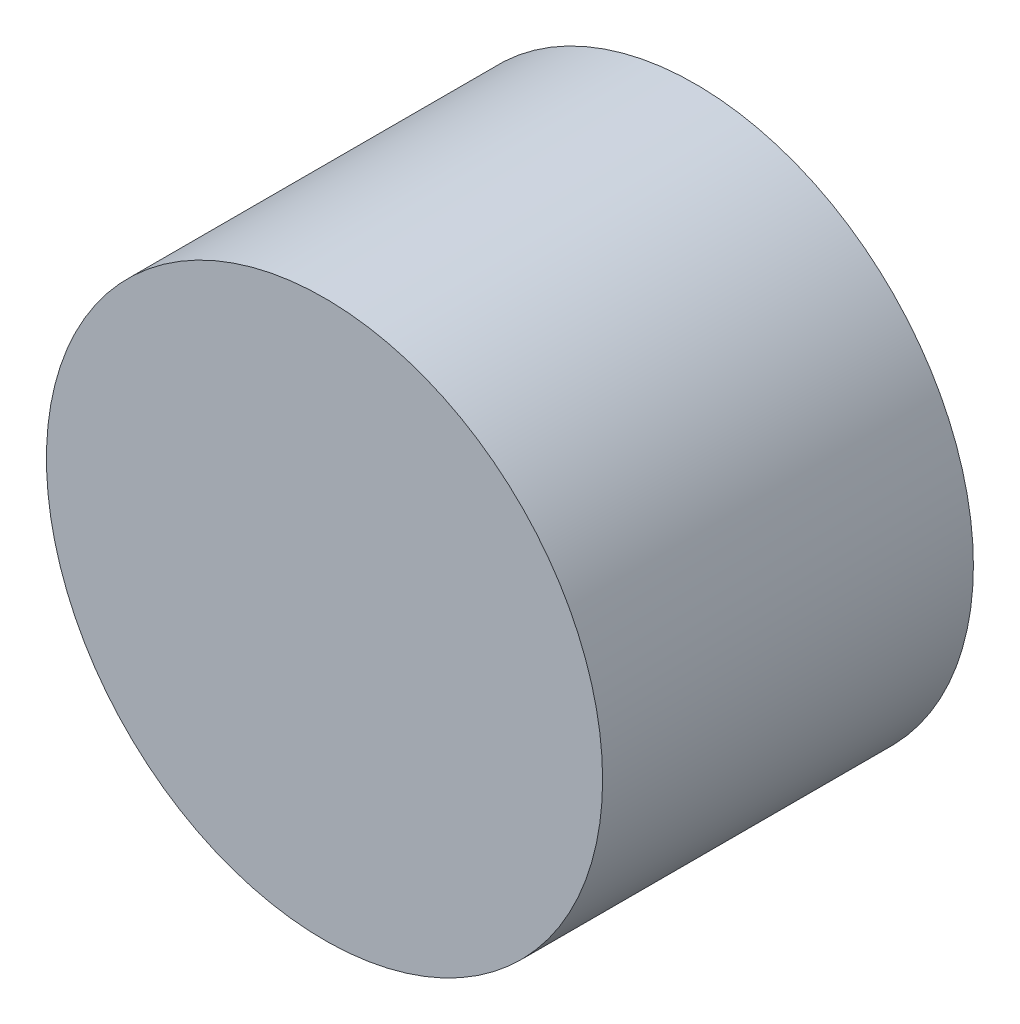
ISO-10303-21;
HEADER;
FILE_DESCRIPTION(('STEP AP214'),'2;1');
FILE_NAME('part.step','',(''),(''),'','','');
FILE_SCHEMA(('AUTOMOTIVE_DESIGN { 1 0 10303 214 1 1 1 1 }'));
ENDSEC;
DATA;
#1=APPLICATION_CONTEXT('core data for automotive mechanical design processes');
#2=APPLICATION_PROTOCOL_DEFINITION('international standard','automotive_design',2000,#1);
#3=PRODUCT_CONTEXT('',#1,'mechanical');
#4=PRODUCT('Part','Part','',(#3));
#5=PRODUCT_RELATED_PRODUCT_CATEGORY('part','',(#4));
#6=PRODUCT_DEFINITION_FORMATION('','',#4);
#7=PRODUCT_DEFINITION_CONTEXT('part definition',#1,'design');
#8=PRODUCT_DEFINITION('design','',#6,#7);
#9=PRODUCT_DEFINITION_SHAPE('','',#8);
#10=(LENGTH_UNIT() NAMED_UNIT(*) SI_UNIT(.MILLI.,.METRE.));
#11=(NAMED_UNIT(*) PLANE_ANGLE_UNIT() SI_UNIT($,.RADIAN.));
#12=(NAMED_UNIT(*) SI_UNIT($,.STERADIAN.) SOLID_ANGLE_UNIT());
#13=UNCERTAINTY_MEASURE_WITH_UNIT(LENGTH_MEASURE(1.E-05),#10,'distance_accuracy_value','');
#14=(GEOMETRIC_REPRESENTATION_CONTEXT(3) GLOBAL_UNCERTAINTY_ASSIGNED_CONTEXT((#13)) GLOBAL_UNIT_ASSIGNED_CONTEXT((#10,
#11,#12)) REPRESENTATION_CONTEXT('',''));
#15=CARTESIAN_POINT('',(0.,0.,0.));
#16=DIRECTION('',(0.,0.,1.));
#17=DIRECTION('',(1.,0.,0.));
#18=AXIS2_PLACEMENT_3D('',#15,#16,#17);
#19=CARTESIAN_POINT('',(0.,0.,50.8));
#20=DIRECTION('',(0.,0.,-1.));
#21=DIRECTION('',(-1.,0.,0.));
#22=AXIS2_PLACEMENT_3D('',#19,#20,#21);
#23=CYLINDRICAL_SURFACE('',#22,38.1);
#24=CARTESIAN_POINT('',(0.,0.,50.8));
#25=DIRECTION('',(0.,0.,1.));
#26=DIRECTION('',(1.,0.,0.));
#27=AXIS2_PLACEMENT_3D('',#24,#25,#26);
#28=CIRCLE('',#27,38.1);
#29=CARTESIAN_POINT('',(38.1,0.,50.8));
#30=VERTEX_POINT('',#29);
#31=EDGE_CURVE('E10',#30,#30,#28,.T.);
#32=ORIENTED_EDGE('',*,*,#31,.F.);
#33=EDGE_LOOP('',(#32));
#34=FACE_BOUND('',#33,.T.);
#35=CARTESIAN_POINT('',(0.,0.,0.));
#36=DIRECTION('',(0.,0.,1.));
#37=DIRECTION('',(1.,0.,0.));
#38=AXIS2_PLACEMENT_3D('',#35,#36,#37);
#39=CIRCLE('',#38,38.1);
#40=CARTESIAN_POINT('',(38.1,0.,0.));
#41=VERTEX_POINT('',#40);
#42=EDGE_CURVE('E46',#41,#41,#39,.T.);
#43=ORIENTED_EDGE('',*,*,#42,.T.);
#44=EDGE_LOOP('',(#43));
#45=FACE_BOUND('',#44,.T.);
#46=ADVANCED_FACE('F43',(#34,#45),#23,.T.);
#47=CARTESIAN_POINT('',(0.,0.,50.8));
#48=DIRECTION('',(0.,0.,1.));
#49=DIRECTION('',(1.,0.,0.));
#50=AXIS2_PLACEMENT_3D('',#47,#48,#49);
#51=PLANE('',#50);
#52=ORIENTED_EDGE('',*,*,#31,.T.);
#53=EDGE_LOOP('',(#52));
#54=FACE_BOUND('',#53,.T.);
#55=ADVANCED_FACE('F60',(#54),#51,.T.);
#56=CARTESIAN_POINT('',(0.,0.,0.));
#57=DIRECTION('',(0.,0.,1.));
#58=DIRECTION('',(1.,0.,0.));
#59=AXIS2_PLACEMENT_3D('',#56,#57,#58);
#60=PLANE('',#59);
#61=ORIENTED_EDGE('',*,*,#42,.F.);
#62=EDGE_LOOP('',(#61));
#63=FACE_BOUND('',#62,.T.);
#64=ADVANCED_FACE('F58',(#63),#60,.F.);
#65=CLOSED_SHELL('',(#46,#55,#64));
#66=MANIFOLD_SOLID_BREP('B2',#65);
#67=ADVANCED_BREP_SHAPE_REPRESENTATION('',(#18,#66),#14);
#68=SHAPE_DEFINITION_REPRESENTATION(#9,#67);
ENDSEC;
END-ISO-10303-21;
